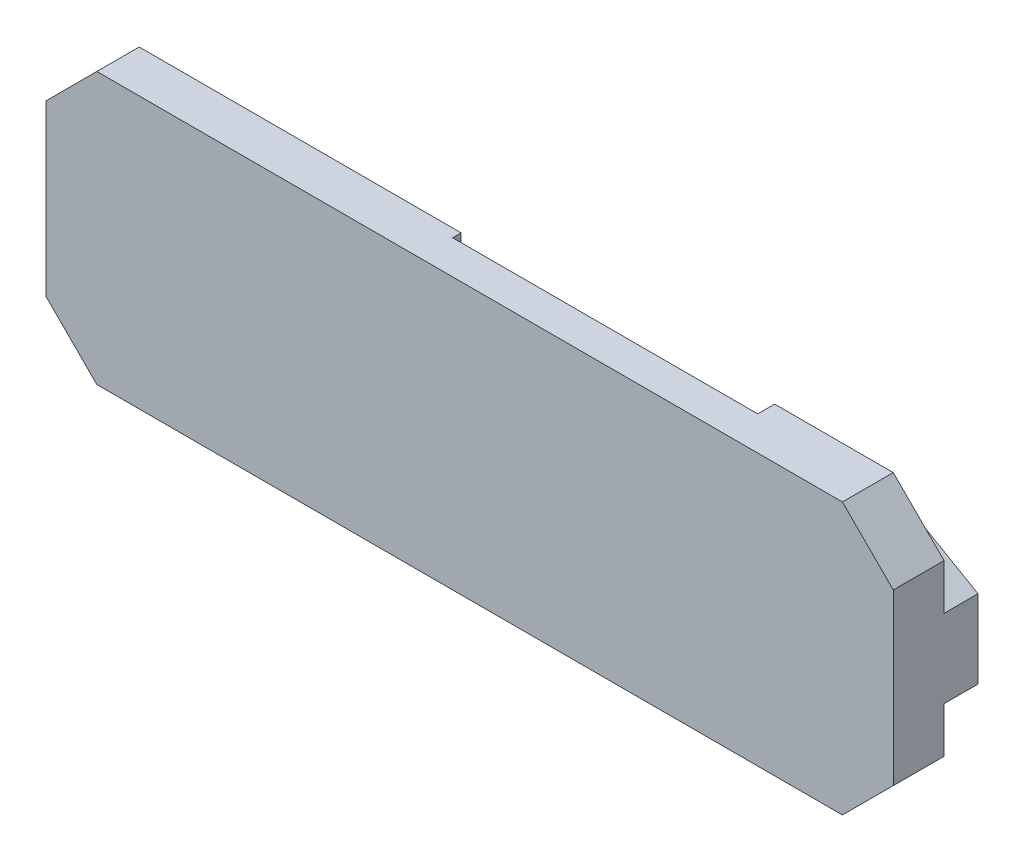
ISO-10303-21;
HEADER;
FILE_DESCRIPTION(('STEP AP214'),'2;1');
FILE_NAME('part.step','',(''),(''),'','','');
FILE_SCHEMA(('AUTOMOTIVE_DESIGN { 1 0 10303 214 1 1 1 1 }'));
ENDSEC;
DATA;
#1=APPLICATION_CONTEXT('core data for automotive mechanical design processes');
#2=APPLICATION_PROTOCOL_DEFINITION('international standard','automotive_design',2000,#1);
#3=PRODUCT_CONTEXT('',#1,'mechanical');
#4=PRODUCT('Part','Part','',(#3));
#5=PRODUCT_RELATED_PRODUCT_CATEGORY('part','',(#4));
#6=PRODUCT_DEFINITION_FORMATION('','',#4);
#7=PRODUCT_DEFINITION_CONTEXT('part definition',#1,'design');
#8=PRODUCT_DEFINITION('design','',#6,#7);
#9=PRODUCT_DEFINITION_SHAPE('','',#8);
#10=(LENGTH_UNIT() NAMED_UNIT(*) SI_UNIT(.MILLI.,.METRE.));
#11=(NAMED_UNIT(*) PLANE_ANGLE_UNIT() SI_UNIT($,.RADIAN.));
#12=(NAMED_UNIT(*) SI_UNIT($,.STERADIAN.) SOLID_ANGLE_UNIT());
#13=UNCERTAINTY_MEASURE_WITH_UNIT(LENGTH_MEASURE(1.E-05),#10,'distance_accuracy_value','');
#14=(GEOMETRIC_REPRESENTATION_CONTEXT(3) GLOBAL_UNCERTAINTY_ASSIGNED_CONTEXT((#13)) GLOBAL_UNIT_ASSIGNED_CONTEXT((#10,
#11,#12)) REPRESENTATION_CONTEXT('',''));
#15=CARTESIAN_POINT('',(0.,0.,0.));
#16=DIRECTION('',(0.,0.,1.));
#17=DIRECTION('',(1.,0.,0.));
#18=AXIS2_PLACEMENT_3D('',#15,#16,#17);
#19=CARTESIAN_POINT('',(0.,0.,0.));
#20=DIRECTION('',(0.,0.,1.));
#21=DIRECTION('',(1.,0.,0.));
#22=AXIS2_PLACEMENT_3D('',#19,#20,#21);
#23=PLANE('',#22);
#24=DIRECTION('',(0.,1.,0.));
#25=VECTOR('',#24,1.);
#26=CARTESIAN_POINT('',(40.,0.,0.));
#27=LINE('',#26,#25);
#28=CARTESIAN_POINT('',(40.,0.,0.));
#29=VERTEX_POINT('',#28);
#30=CARTESIAN_POINT('',(40.,16.,0.));
#31=VERTEX_POINT('',#30);
#32=EDGE_CURVE('E191',#29,#31,#27,.T.);
#33=ORIENTED_EDGE('',*,*,#32,.F.);
#34=DIRECTION('',(1.,0.,0.));
#35=VECTOR('',#34,1.);
#36=CARTESIAN_POINT('',(0.,0.,0.));
#37=LINE('',#36,#35);
#38=CARTESIAN_POINT('',(22.,0.,0.));
#39=VERTEX_POINT('',#38);
#40=EDGE_CURVE('E246',#39,#29,#37,.T.);
#41=ORIENTED_EDGE('',*,*,#40,.F.);
#42=DIRECTION('',(0.,-1.,0.));
#43=VECTOR('',#42,1.);
#44=CARTESIAN_POINT('',(22.,16.,0.));
#45=LINE('',#44,#43);
#46=CARTESIAN_POINT('',(22.,16.,0.));
#47=VERTEX_POINT('',#46);
#48=EDGE_CURVE('E220',#47,#39,#45,.T.);
#49=ORIENTED_EDGE('',*,*,#48,.F.);
#50=DIRECTION('',(1.,0.,0.));
#51=VECTOR('',#50,1.);
#52=CARTESIAN_POINT('',(0.,16.,0.));
#53=LINE('',#52,#51);
#54=EDGE_CURVE('E241',#47,#31,#53,.T.);
#55=ORIENTED_EDGE('',*,*,#54,.T.);
#56=EDGE_LOOP('',(#33,#41,#49,#55));
#57=FACE_BOUND('',#56,.T.);
#58=ADVANCED_FACE('F39',(#57),#23,.F.);
#59=CARTESIAN_POINT('',(50.,0.,2.));
#60=DIRECTION('',(-1.,0.,0.));
#61=DIRECTION('',(0.,0.,1.));
#62=AXIS2_PLACEMENT_3D('',#59,#60,#61);
#63=PLANE('',#62);
#64=DIRECTION('',(0.,0.,-1.));
#65=VECTOR('',#64,1.);
#66=CARTESIAN_POINT('',(50.,3.00000000000001,2.));
#67=LINE('',#66,#65);
#68=CARTESIAN_POINT('',(50.,3.00000000000001,2.));
#69=VERTEX_POINT('',#68);
#70=CARTESIAN_POINT('',(50.,3.00000000000002,-1.));
#71=VERTEX_POINT('',#70);
#72=EDGE_CURVE('E263',#69,#71,#67,.T.);
#73=ORIENTED_EDGE('',*,*,#72,.T.);
#74=DIRECTION('',(0.,-1.,0.));
#75=VECTOR('',#74,1.);
#76=CARTESIAN_POINT('',(50.,0.,-1.));
#77=LINE('',#76,#75);
#78=CARTESIAN_POINT('',(50.,5.6905989232415,-1.));
#79=VERTEX_POINT('',#78);
#80=EDGE_CURVE('E209',#79,#71,#77,.T.);
#81=ORIENTED_EDGE('',*,*,#80,.F.);
#82=DIRECTION('',(0.,0.,1.));
#83=VECTOR('',#82,1.);
#84=CARTESIAN_POINT('',(50.,5.6905989232415,-3.));
#85=LINE('',#84,#83);
#86=CARTESIAN_POINT('',(50.,5.6905989232415,-3.));
#87=VERTEX_POINT('',#86);
#88=EDGE_CURVE('E195',#87,#79,#85,.T.);
#89=ORIENTED_EDGE('',*,*,#88,.F.);
#90=DIRECTION('',(0.,-1.,0.));
#91=VECTOR('',#90,1.);
#92=CARTESIAN_POINT('',(50.,10.3094010767585,-3.));
#93=LINE('',#92,#91);
#94=CARTESIAN_POINT('',(50.,10.3094010767585,-3.));
#95=VERTEX_POINT('',#94);
#96=EDGE_CURVE('E178',#95,#87,#93,.T.);
#97=ORIENTED_EDGE('',*,*,#96,.F.);
#98=DIRECTION('',(0.,0.,1.));
#99=VECTOR('',#98,1.);
#100=CARTESIAN_POINT('',(50.,10.3094010767585,-3.));
#101=LINE('',#100,#99);
#102=CARTESIAN_POINT('',(50.,10.3094010767585,-1.));
#103=VERTEX_POINT('',#102);
#104=EDGE_CURVE('E175',#95,#103,#101,.T.);
#105=ORIENTED_EDGE('',*,*,#104,.T.);
#106=CARTESIAN_POINT('',(50.,13.,-1.));
#107=VERTEX_POINT('',#106);
#108=EDGE_CURVE('E210',#107,#103,#77,.T.);
#109=ORIENTED_EDGE('',*,*,#108,.F.);
#110=DIRECTION('',(0.,0.,-1.));
#111=VECTOR('',#110,1.);
#112=CARTESIAN_POINT('',(50.,13.,2.));
#113=LINE('',#112,#111);
#114=CARTESIAN_POINT('',(50.,13.,2.));
#115=VERTEX_POINT('',#114);
#116=EDGE_CURVE('E285',#115,#107,#113,.T.);
#117=ORIENTED_EDGE('',*,*,#116,.F.);
#118=DIRECTION('',(0.,1.,0.));
#119=VECTOR('',#118,1.);
#120=CARTESIAN_POINT('',(50.,0.,2.));
#121=LINE('',#120,#119);
#122=EDGE_CURVE('E242',#69,#115,#121,.T.);
#123=ORIENTED_EDGE('',*,*,#122,.F.);
#124=EDGE_LOOP('',(#73,#81,#89,#97,#105,#109,#117,#123));
#125=FACE_BOUND('',#124,.T.);
#126=ADVANCED_FACE('F340',(#125),#63,.F.);
#127=CARTESIAN_POINT('',(31.5,31.5,2.));
#128=DIRECTION('',(-0.707106781186547,-0.707106781186548,0.));
#129=DIRECTION('',(0.707106781186548,-0.707106781186547,0.));
#130=AXIS2_PLACEMENT_3D('',#127,#128,#129);
#131=PLANE('',#130);
#132=ORIENTED_EDGE('',*,*,#116,.T.);
#133=DIRECTION('',(0.707106781186548,-0.707106781186547,0.));
#134=VECTOR('',#133,1.);
#135=CARTESIAN_POINT('',(31.5,31.5,-1.));
#136=LINE('',#135,#134);
#137=CARTESIAN_POINT('',(47.,16.,-1.));
#138=VERTEX_POINT('',#137);
#139=EDGE_CURVE('E206',#138,#107,#136,.T.);
#140=ORIENTED_EDGE('',*,*,#139,.F.);
#141=DIRECTION('',(0.,0.,-1.));
#142=VECTOR('',#141,1.);
#143=CARTESIAN_POINT('',(47.,16.,2.));
#144=LINE('',#143,#142);
#145=CARTESIAN_POINT('',(47.,16.,2.));
#146=VERTEX_POINT('',#145);
#147=EDGE_CURVE('E283',#146,#138,#144,.T.);
#148=ORIENTED_EDGE('',*,*,#147,.F.);
#149=DIRECTION('',(-0.707106781186548,0.707106781186547,0.));
#150=VECTOR('',#149,1.);
#151=CARTESIAN_POINT('',(31.5,31.5,2.));
#152=LINE('',#151,#150);
#153=EDGE_CURVE('E245',#115,#146,#152,.T.);
#154=ORIENTED_EDGE('',*,*,#153,.F.);
#155=EDGE_LOOP('',(#132,#140,#148,#154));
#156=FACE_BOUND('',#155,.T.);
#157=ADVANCED_FACE('F336',(#156),#131,.F.);
#158=CARTESIAN_POINT('',(0.,16.,2.));
#159=DIRECTION('',(0.,1.,0.));
#160=DIRECTION('',(0.,0.,1.));
#161=AXIS2_PLACEMENT_3D('',#158,#159,#160);
#162=PLANE('',#161);
#163=ORIENTED_EDGE('',*,*,#54,.F.);
#164=DIRECTION('',(0.,0.,1.));
#165=VECTOR('',#164,1.);
#166=CARTESIAN_POINT('',(22.,16.,-0.5));
#167=LINE('',#166,#165);
#168=CARTESIAN_POINT('',(22.,16.,-0.5));
#169=VERTEX_POINT('',#168);
#170=EDGE_CURVE('E238',#169,#47,#167,.T.);
#171=ORIENTED_EDGE('',*,*,#170,.F.);
#172=DIRECTION('',(1.,0.,0.));
#173=VECTOR('',#172,1.);
#174=CARTESIAN_POINT('',(3.,16.,-0.5));
#175=LINE('',#174,#173);
#176=CARTESIAN_POINT('',(3.,16.,-0.5));
#177=VERTEX_POINT('',#176);
#178=EDGE_CURVE('E226',#177,#169,#175,.T.);
#179=ORIENTED_EDGE('',*,*,#178,.F.);
#180=DIRECTION('',(0.,0.,-1.));
#181=VECTOR('',#180,1.);
#182=CARTESIAN_POINT('',(3.,16.,2.));
#183=LINE('',#182,#181);
#184=CARTESIAN_POINT('',(3.,16.,2.));
#185=VERTEX_POINT('',#184);
#186=EDGE_CURVE('E280',#185,#177,#183,.T.);
#187=ORIENTED_EDGE('',*,*,#186,.F.);
#188=DIRECTION('',(1.,0.,0.));
#189=VECTOR('',#188,1.);
#190=CARTESIAN_POINT('',(0.,16.,2.));
#191=LINE('',#190,#189);
#192=EDGE_CURVE('E248',#185,#146,#191,.T.);
#193=ORIENTED_EDGE('',*,*,#192,.T.);
#194=ORIENTED_EDGE('',*,*,#147,.T.);
#195=DIRECTION('',(1.,0.,0.));
#196=VECTOR('',#195,1.);
#197=CARTESIAN_POINT('',(0.,16.,-1.));
#198=LINE('',#197,#196);
#199=CARTESIAN_POINT('',(40.,16.,-1.));
#200=VERTEX_POINT('',#199);
#201=EDGE_CURVE('E203',#200,#138,#198,.T.);
#202=ORIENTED_EDGE('',*,*,#201,.F.);
#203=DIRECTION('',(0.,0.,1.));
#204=VECTOR('',#203,1.);
#205=CARTESIAN_POINT('',(40.,16.,-1.));
#206=LINE('',#205,#204);
#207=EDGE_CURVE('E214',#200,#31,#206,.T.);
#208=ORIENTED_EDGE('',*,*,#207,.T.);
#209=EDGE_LOOP('',(#163,#171,#179,#187,#193,#194,#202,#208));
#210=FACE_BOUND('',#209,.T.);
#211=ADVANCED_FACE('F314',(#210),#162,.T.);
#212=CARTESIAN_POINT('',(-6.5,6.5,2.));
#213=DIRECTION('',(-0.707106781186547,0.707106781186548,0.));
#214=DIRECTION('',(-0.707106781186548,-0.707106781186547,0.));
#215=AXIS2_PLACEMENT_3D('',#212,#213,#214);
#216=PLANE('',#215);
#217=DIRECTION('',(0.707106781186548,0.707106781186547,0.));
#218=VECTOR('',#217,1.);
#219=CARTESIAN_POINT('',(0.,13.,-0.5));
#220=LINE('',#219,#218);
#221=CARTESIAN_POINT('',(1.,14.,-0.5));
#222=VERTEX_POINT('',#221);
#223=EDGE_CURVE('E224',#222,#177,#220,.T.);
#224=ORIENTED_EDGE('',*,*,#223,.F.);
#225=CARTESIAN_POINT('',(1.,14.,0.5));
#226=DIRECTION('',(-0.707106781186547,0.707106781186548,0.));
#227=DIRECTION('',(0.707106781186548,0.707106781186547,0.));
#228=AXIS2_PLACEMENT_3D('',#225,#226,#227);
#229=ELLIPSE('',#228,1.41421356237309,1.);
#230=CARTESIAN_POINT('',(0.,13.,0.5));
#231=VERTEX_POINT('',#230);
#232=EDGE_CURVE('E290',#222,#231,#229,.T.);
#233=ORIENTED_EDGE('',*,*,#232,.T.);
#234=DIRECTION('',(0.,0.,-1.));
#235=VECTOR('',#234,1.);
#236=CARTESIAN_POINT('',(0.,13.,2.));
#237=LINE('',#236,#235);
#238=CARTESIAN_POINT('',(0.,13.,2.));
#239=VERTEX_POINT('',#238);
#240=EDGE_CURVE('E277',#239,#231,#237,.T.);
#241=ORIENTED_EDGE('',*,*,#240,.F.);
#242=DIRECTION('',(0.707106781186548,0.707106781186547,0.));
#243=VECTOR('',#242,1.);
#244=CARTESIAN_POINT('',(-6.5,6.5,2.));
#245=LINE('',#244,#243);
#246=EDGE_CURVE('E251',#239,#185,#245,.T.);
#247=ORIENTED_EDGE('',*,*,#246,.T.);
#248=ORIENTED_EDGE('',*,*,#186,.T.);
#249=EDGE_LOOP('',(#224,#233,#241,#247,#248));
#250=FACE_BOUND('',#249,.T.);
#251=ADVANCED_FACE('F307',(#250),#216,.T.);
#252=CARTESIAN_POINT('',(0.,0.,2.));
#253=DIRECTION('',(-1.,0.,0.));
#254=DIRECTION('',(0.,0.,1.));
#255=AXIS2_PLACEMENT_3D('',#252,#253,#254);
#256=PLANE('',#255);
#257=ORIENTED_EDGE('',*,*,#240,.T.);
#258=DIRECTION('',(0.,1.,0.));
#259=VECTOR('',#258,1.);
#260=CARTESIAN_POINT('',(0.,0.,0.5));
#261=LINE('',#260,#259);
#262=CARTESIAN_POINT('',(0.,3.,0.5));
#263=VERTEX_POINT('',#262);
#264=EDGE_CURVE('E47',#231,#263,#261,.F.);
#265=ORIENTED_EDGE('',*,*,#264,.T.);
#266=DIRECTION('',(0.,0.,-1.));
#267=VECTOR('',#266,1.);
#268=CARTESIAN_POINT('',(0.,3.,2.));
#269=LINE('',#268,#267);
#270=CARTESIAN_POINT('',(0.,3.,2.));
#271=VERTEX_POINT('',#270);
#272=EDGE_CURVE('E274',#271,#263,#269,.T.);
#273=ORIENTED_EDGE('',*,*,#272,.F.);
#274=DIRECTION('',(0.,1.,0.));
#275=VECTOR('',#274,1.);
#276=CARTESIAN_POINT('',(0.,0.,2.));
#277=LINE('',#276,#275);
#278=EDGE_CURVE('E254',#271,#239,#277,.T.);
#279=ORIENTED_EDGE('',*,*,#278,.T.);
#280=EDGE_LOOP('',(#257,#265,#273,#279));
#281=FACE_BOUND('',#280,.T.);
#282=ADVANCED_FACE('F293',(#281),#256,.T.);
#283=CARTESIAN_POINT('',(1.5,1.5,2.));
#284=DIRECTION('',(0.707106781186548,0.707106781186547,0.));
#285=DIRECTION('',(-0.707106781186547,0.707106781186548,0.));
#286=AXIS2_PLACEMENT_3D('',#283,#284,#285);
#287=PLANE('',#286);
#288=ORIENTED_EDGE('',*,*,#272,.T.);
#289=CARTESIAN_POINT('',(1.,2.,0.5));
#290=DIRECTION('',(0.707106781186548,0.707106781186547,0.));
#291=DIRECTION('',(-0.707106781186547,0.707106781186548,0.));
#292=AXIS2_PLACEMENT_3D('',#289,#290,#291);
#293=ELLIPSE('',#292,1.4142135623731,1.);
#294=CARTESIAN_POINT('',(1.,2.,-0.5));
#295=VERTEX_POINT('',#294);
#296=EDGE_CURVE('E11',#263,#295,#293,.F.);
#297=ORIENTED_EDGE('',*,*,#296,.T.);
#298=DIRECTION('',(-0.707106781186547,0.707106781186548,0.));
#299=VECTOR('',#298,1.);
#300=CARTESIAN_POINT('',(3.,0.,-0.5));
#301=LINE('',#300,#299);
#302=CARTESIAN_POINT('',(3.,0.,-0.5));
#303=VERTEX_POINT('',#302);
#304=EDGE_CURVE('E221',#303,#295,#301,.T.);
#305=ORIENTED_EDGE('',*,*,#304,.F.);
#306=DIRECTION('',(0.,0.,-1.));
#307=VECTOR('',#306,1.);
#308=CARTESIAN_POINT('',(3.,0.,2.));
#309=LINE('',#308,#307);
#310=CARTESIAN_POINT('',(3.,0.,2.));
#311=VERTEX_POINT('',#310);
#312=EDGE_CURVE('E272',#311,#303,#309,.T.);
#313=ORIENTED_EDGE('',*,*,#312,.F.);
#314=DIRECTION('',(0.707106781186547,-0.707106781186548,0.));
#315=VECTOR('',#314,1.);
#316=CARTESIAN_POINT('',(1.5,1.5,2.));
#317=LINE('',#316,#315);
#318=EDGE_CURVE('E257',#271,#311,#317,.T.);
#319=ORIENTED_EDGE('',*,*,#318,.F.);
#320=EDGE_LOOP('',(#288,#297,#305,#313,#319));
#321=FACE_BOUND('',#320,.T.);
#322=ADVANCED_FACE('F298',(#321),#287,.F.);
#323=CARTESIAN_POINT('',(0.,0.,2.));
#324=DIRECTION('',(0.,1.,0.));
#325=DIRECTION('',(0.,0.,1.));
#326=AXIS2_PLACEMENT_3D('',#323,#324,#325);
#327=PLANE('',#326);
#328=ORIENTED_EDGE('',*,*,#312,.T.);
#329=DIRECTION('',(-1.,0.,0.));
#330=VECTOR('',#329,1.);
#331=CARTESIAN_POINT('',(22.,0.,-0.5));
#332=LINE('',#331,#330);
#333=CARTESIAN_POINT('',(22.,0.,-0.5));
#334=VERTEX_POINT('',#333);
#335=EDGE_CURVE('E230',#334,#303,#332,.T.);
#336=ORIENTED_EDGE('',*,*,#335,.F.);
#337=DIRECTION('',(0.,0.,1.));
#338=VECTOR('',#337,1.);
#339=CARTESIAN_POINT('',(22.,0.,-0.5));
#340=LINE('',#339,#338);
#341=EDGE_CURVE('E233',#334,#39,#340,.T.);
#342=ORIENTED_EDGE('',*,*,#341,.T.);
#343=ORIENTED_EDGE('',*,*,#40,.T.);
#344=DIRECTION('',(0.,0.,1.));
#345=VECTOR('',#344,1.);
#346=CARTESIAN_POINT('',(40.,0.,-1.));
#347=LINE('',#346,#345);
#348=CARTESIAN_POINT('',(40.,0.,-1.));
#349=VERTEX_POINT('',#348);
#350=EDGE_CURVE('E218',#349,#29,#347,.T.);
#351=ORIENTED_EDGE('',*,*,#350,.F.);
#352=DIRECTION('',(-1.,0.,0.));
#353=VECTOR('',#352,1.);
#354=CARTESIAN_POINT('',(0.,0.,-1.));
#355=LINE('',#354,#353);
#356=CARTESIAN_POINT('',(47.,0.,-1.));
#357=VERTEX_POINT('',#356);
#358=EDGE_CURVE('E193',#357,#349,#355,.T.);
#359=ORIENTED_EDGE('',*,*,#358,.F.);
#360=DIRECTION('',(0.,0.,-1.));
#361=VECTOR('',#360,1.);
#362=CARTESIAN_POINT('',(47.,0.,2.));
#363=LINE('',#362,#361);
#364=CARTESIAN_POINT('',(47.,0.,2.));
#365=VERTEX_POINT('',#364);
#366=EDGE_CURVE('E270',#365,#357,#363,.T.);
#367=ORIENTED_EDGE('',*,*,#366,.F.);
#368=DIRECTION('',(1.,0.,0.));
#369=VECTOR('',#368,1.);
#370=CARTESIAN_POINT('',(0.,0.,2.));
#371=LINE('',#370,#369);
#372=EDGE_CURVE('E259',#311,#365,#371,.T.);
#373=ORIENTED_EDGE('',*,*,#372,.F.);
#374=EDGE_LOOP('',(#328,#336,#342,#343,#351,#359,#367,#373));
#375=FACE_BOUND('',#374,.T.);
#376=ADVANCED_FACE('F321',(#375),#327,.F.);
#377=CARTESIAN_POINT('',(23.5,-23.5,2.));
#378=DIRECTION('',(-0.707106781186547,0.707106781186548,0.));
#379=DIRECTION('',(-0.707106781186548,-0.707106781186547,0.));
#380=AXIS2_PLACEMENT_3D('',#377,#378,#379);
#381=PLANE('',#380);
#382=ORIENTED_EDGE('',*,*,#366,.T.);
#383=DIRECTION('',(-0.707106781186548,-0.707106781186547,0.));
#384=VECTOR('',#383,1.);
#385=CARTESIAN_POINT('',(23.5,-23.5,-1.));
#386=LINE('',#385,#384);
#387=EDGE_CURVE('E212',#71,#357,#386,.T.);
#388=ORIENTED_EDGE('',*,*,#387,.F.);
#389=ORIENTED_EDGE('',*,*,#72,.F.);
#390=DIRECTION('',(0.707106781186548,0.707106781186547,0.));
#391=VECTOR('',#390,1.);
#392=CARTESIAN_POINT('',(23.5,-23.5,2.));
#393=LINE('',#392,#391);
#394=EDGE_CURVE('E261',#365,#69,#393,.T.);
#395=ORIENTED_EDGE('',*,*,#394,.F.);
#396=EDGE_LOOP('',(#382,#388,#389,#395));
#397=FACE_BOUND('',#396,.T.);
#398=ADVANCED_FACE('F380',(#397),#381,.F.);
#399=CARTESIAN_POINT('',(0.,0.,2.));
#400=DIRECTION('',(0.,0.,1.));
#401=DIRECTION('',(1.,0.,0.));
#402=AXIS2_PLACEMENT_3D('',#399,#400,#401);
#403=PLANE('',#402);
#404=ORIENTED_EDGE('',*,*,#122,.T.);
#405=ORIENTED_EDGE('',*,*,#153,.T.);
#406=ORIENTED_EDGE('',*,*,#192,.F.);
#407=ORIENTED_EDGE('',*,*,#246,.F.);
#408=ORIENTED_EDGE('',*,*,#278,.F.);
#409=ORIENTED_EDGE('',*,*,#318,.T.);
#410=ORIENTED_EDGE('',*,*,#372,.T.);
#411=ORIENTED_EDGE('',*,*,#394,.T.);
#412=EDGE_LOOP('',(#404,#405,#406,#407,#408,#409,#410,#411));
#413=FACE_BOUND('',#412,.T.);
#414=ADVANCED_FACE('F327',(#413),#403,.T.);
#415=CARTESIAN_POINT('',(22.,16.,-0.5));
#416=DIRECTION('',(-1.,0.,0.));
#417=DIRECTION('',(0.,-1.,0.));
#418=AXIS2_PLACEMENT_3D('',#415,#416,#417);
#419=PLANE('',#418);
#420=ORIENTED_EDGE('',*,*,#48,.T.);
#421=ORIENTED_EDGE('',*,*,#341,.F.);
#422=DIRECTION('',(0.,-1.,0.));
#423=VECTOR('',#422,1.);
#424=CARTESIAN_POINT('',(22.,16.,-0.5));
#425=LINE('',#424,#423);
#426=EDGE_CURVE('E228',#169,#334,#425,.T.);
#427=ORIENTED_EDGE('',*,*,#426,.F.);
#428=ORIENTED_EDGE('',*,*,#170,.T.);
#429=EDGE_LOOP('',(#420,#421,#427,#428));
#430=FACE_BOUND('',#429,.T.);
#431=ADVANCED_FACE('F319',(#430),#419,.F.);
#432=CARTESIAN_POINT('',(0.,0.,-0.5));
#433=DIRECTION('',(0.,0.,-1.));
#434=DIRECTION('',(-1.,0.,0.));
#435=AXIS2_PLACEMENT_3D('',#432,#433,#434);
#436=PLANE('',#435);
#437=ORIENTED_EDGE('',*,*,#304,.T.);
#438=DIRECTION('',(0.,1.,0.));
#439=VECTOR('',#438,1.);
#440=CARTESIAN_POINT('',(1.,0.,-0.5));
#441=LINE('',#440,#439);
#442=EDGE_CURVE('E287',#295,#222,#441,.T.);
#443=ORIENTED_EDGE('',*,*,#442,.T.);
#444=ORIENTED_EDGE('',*,*,#223,.T.);
#445=ORIENTED_EDGE('',*,*,#178,.T.);
#446=ORIENTED_EDGE('',*,*,#426,.T.);
#447=ORIENTED_EDGE('',*,*,#335,.T.);
#448=EDGE_LOOP('',(#437,#443,#444,#445,#446,#447));
#449=FACE_BOUND('',#448,.T.);
#450=ADVANCED_FACE('F305',(#449),#436,.T.);
#451=CARTESIAN_POINT('',(1.,0.,0.5));
#452=DIRECTION('',(0.,1.,0.));
#453=DIRECTION('',(0.,0.,1.));
#454=AXIS2_PLACEMENT_3D('',#451,#452,#453);
#455=CYLINDRICAL_SURFACE('',#454,1.);
#456=ORIENTED_EDGE('',*,*,#296,.F.);
#457=ORIENTED_EDGE('',*,*,#264,.F.);
#458=ORIENTED_EDGE('',*,*,#232,.F.);
#459=ORIENTED_EDGE('',*,*,#442,.F.);
#460=EDGE_LOOP('',(#456,#457,#458,#459));
#461=FACE_BOUND('',#460,.T.);
#462=ADVANCED_FACE('F41',(#461),#455,.T.);
#463=CARTESIAN_POINT('',(40.,0.,-1.));
#464=DIRECTION('',(1.,0.,0.));
#465=DIRECTION('',(0.,1.,0.));
#466=AXIS2_PLACEMENT_3D('',#463,#464,#465);
#467=PLANE('',#466);
#468=ORIENTED_EDGE('',*,*,#32,.T.);
#469=ORIENTED_EDGE('',*,*,#207,.F.);
#470=DIRECTION('',(0.,1.,0.));
#471=VECTOR('',#470,1.);
#472=CARTESIAN_POINT('',(40.,0.,-1.));
#473=LINE('',#472,#471);
#474=EDGE_CURVE('E201',#349,#200,#473,.T.);
#475=ORIENTED_EDGE('',*,*,#474,.F.);
#476=ORIENTED_EDGE('',*,*,#350,.T.);
#477=EDGE_LOOP('',(#468,#469,#475,#476));
#478=FACE_BOUND('',#477,.T.);
#479=ADVANCED_FACE('F370',(#478),#467,.F.);
#480=CARTESIAN_POINT('',(0.,0.,-1.));
#481=DIRECTION('',(0.,0.,-1.));
#482=DIRECTION('',(-1.,0.,0.));
#483=AXIS2_PLACEMENT_3D('',#480,#481,#482);
#484=PLANE('',#483);
#485=DIRECTION('',(-0.866025403784439,-0.5,0.));
#486=VECTOR('',#485,1.);
#487=CARTESIAN_POINT('',(50.,5.6905989232415,-1.));
#488=LINE('',#487,#486);
#489=CARTESIAN_POINT('',(46.,3.381197846483,-1.));
#490=VERTEX_POINT('',#489);
#491=EDGE_CURVE('E342',#79,#490,#488,.T.);
#492=ORIENTED_EDGE('',*,*,#491,.F.);
#493=ORIENTED_EDGE('',*,*,#80,.T.);
#494=ORIENTED_EDGE('',*,*,#387,.T.);
#495=ORIENTED_EDGE('',*,*,#358,.T.);
#496=ORIENTED_EDGE('',*,*,#474,.T.);
#497=ORIENTED_EDGE('',*,*,#201,.T.);
#498=ORIENTED_EDGE('',*,*,#139,.T.);
#499=ORIENTED_EDGE('',*,*,#108,.T.);
#500=DIRECTION('',(0.866025403784438,-0.500000000000001,0.));
#501=VECTOR('',#500,1.);
#502=CARTESIAN_POINT('',(46.,12.618802153517,-1.));
#503=LINE('',#502,#501);
#504=CARTESIAN_POINT('',(46.,12.618802153517,-1.));
#505=VERTEX_POINT('',#504);
#506=EDGE_CURVE('E341',#505,#103,#503,.T.);
#507=ORIENTED_EDGE('',*,*,#506,.F.);
#508=DIRECTION('',(0.866025403784439,0.499999999999999,0.));
#509=VECTOR('',#508,1.);
#510=CARTESIAN_POINT('',(42.,10.3094010767585,-1.));
#511=LINE('',#510,#509);
#512=CARTESIAN_POINT('',(42.,10.3094010767585,-1.));
#513=VERTEX_POINT('',#512);
#514=EDGE_CURVE('E190',#513,#505,#511,.T.);
#515=ORIENTED_EDGE('',*,*,#514,.F.);
#516=DIRECTION('',(0.,1.,0.));
#517=VECTOR('',#516,1.);
#518=CARTESIAN_POINT('',(42.,5.69059892324151,-1.));
#519=LINE('',#518,#517);
#520=CARTESIAN_POINT('',(42.,5.69059892324151,-1.));
#521=VERTEX_POINT('',#520);
#522=EDGE_CURVE('E59',#521,#513,#519,.T.);
#523=ORIENTED_EDGE('',*,*,#522,.F.);
#524=DIRECTION('',(-0.866025403784439,0.5,0.));
#525=VECTOR('',#524,1.);
#526=CARTESIAN_POINT('',(46.,3.381197846483,-1.));
#527=LINE('',#526,#525);
#528=EDGE_CURVE('E54',#490,#521,#527,.T.);
#529=ORIENTED_EDGE('',*,*,#528,.F.);
#530=EDGE_LOOP('',(#492,#493,#494,#495,#496,#497,#498,#499,#507,#515,#523,#529));
#531=FACE_BOUND('',#530,.T.);
#532=ADVANCED_FACE('F333',(#531),#484,.T.);
#533=CARTESIAN_POINT('',(42.,10.3094010767585,-3.));
#534=DIRECTION('',(0.499999999999999,-0.866025403784439,0.));
#535=DIRECTION('',(0.866025403784439,0.499999999999999,0.));
#536=AXIS2_PLACEMENT_3D('',#533,#534,#535);
#537=PLANE('',#536);
#538=ORIENTED_EDGE('',*,*,#514,.T.);
#539=DIRECTION('',(0.,0.,1.));
#540=VECTOR('',#539,1.);
#541=CARTESIAN_POINT('',(46.,12.618802153517,-3.));
#542=LINE('',#541,#540);
#543=CARTESIAN_POINT('',(46.,12.618802153517,-3.));
#544=VERTEX_POINT('',#543);
#545=EDGE_CURVE('E172',#544,#505,#542,.T.);
#546=ORIENTED_EDGE('',*,*,#545,.F.);
#547=DIRECTION('',(0.866025403784439,0.499999999999999,0.));
#548=VECTOR('',#547,1.);
#549=CARTESIAN_POINT('',(42.,10.3094010767585,-3.));
#550=LINE('',#549,#548);
#551=CARTESIAN_POINT('',(42.,10.3094010767585,-3.));
#552=VERTEX_POINT('',#551);
#553=EDGE_CURVE('E179',#552,#544,#550,.T.);
#554=ORIENTED_EDGE('',*,*,#553,.F.);
#555=DIRECTION('',(0.,0.,1.));
#556=VECTOR('',#555,1.);
#557=CARTESIAN_POINT('',(42.,10.3094010767585,-3.));
#558=LINE('',#557,#556);
#559=EDGE_CURVE('E350',#552,#513,#558,.T.);
#560=ORIENTED_EDGE('',*,*,#559,.T.);
#561=EDGE_LOOP('',(#538,#546,#554,#560));
#562=FACE_BOUND('',#561,.T.);
#563=ADVANCED_FACE('F189',(#562),#537,.F.);
#564=CARTESIAN_POINT('',(46.,12.618802153517,-3.));
#565=DIRECTION('',(-0.500000000000001,-0.866025403784438,0.));
#566=DIRECTION('',(0.866025403784438,-0.500000000000001,0.));
#567=AXIS2_PLACEMENT_3D('',#564,#565,#566);
#568=PLANE('',#567);
#569=ORIENTED_EDGE('',*,*,#506,.T.);
#570=ORIENTED_EDGE('',*,*,#104,.F.);
#571=DIRECTION('',(0.866025403784438,-0.500000000000001,0.));
#572=VECTOR('',#571,1.);
#573=CARTESIAN_POINT('',(46.,12.618802153517,-3.));
#574=LINE('',#573,#572);
#575=EDGE_CURVE('E167',#544,#95,#574,.T.);
#576=ORIENTED_EDGE('',*,*,#575,.F.);
#577=ORIENTED_EDGE('',*,*,#545,.T.);
#578=EDGE_LOOP('',(#569,#570,#576,#577));
#579=FACE_BOUND('',#578,.T.);
#580=ADVANCED_FACE('F170',(#579),#568,.F.);
#581=CARTESIAN_POINT('',(50.,5.6905989232415,-3.));
#582=DIRECTION('',(-0.5,0.866025403784439,0.));
#583=DIRECTION('',(-0.866025403784439,-0.5,0.));
#584=AXIS2_PLACEMENT_3D('',#581,#582,#583);
#585=PLANE('',#584);
#586=ORIENTED_EDGE('',*,*,#491,.T.);
#587=DIRECTION('',(0.,0.,1.));
#588=VECTOR('',#587,1.);
#589=CARTESIAN_POINT('',(46.,3.381197846483,-3.));
#590=LINE('',#589,#588);
#591=CARTESIAN_POINT('',(46.,3.381197846483,-3.));
#592=VERTEX_POINT('',#591);
#593=EDGE_CURVE('E355',#592,#490,#590,.T.);
#594=ORIENTED_EDGE('',*,*,#593,.F.);
#595=DIRECTION('',(-0.866025403784439,-0.5,0.));
#596=VECTOR('',#595,1.);
#597=CARTESIAN_POINT('',(50.,5.6905989232415,-3.));
#598=LINE('',#597,#596);
#599=EDGE_CURVE('E363',#87,#592,#598,.T.);
#600=ORIENTED_EDGE('',*,*,#599,.F.);
#601=ORIENTED_EDGE('',*,*,#88,.T.);
#602=EDGE_LOOP('',(#586,#594,#600,#601));
#603=FACE_BOUND('',#602,.T.);
#604=ADVANCED_FACE('F361',(#603),#585,.F.);
#605=CARTESIAN_POINT('',(46.,3.381197846483,-3.));
#606=DIRECTION('',(0.5,0.866025403784439,0.));
#607=DIRECTION('',(-0.866025403784439,0.5,0.));
#608=AXIS2_PLACEMENT_3D('',#605,#606,#607);
#609=PLANE('',#608);
#610=ORIENTED_EDGE('',*,*,#528,.T.);
#611=DIRECTION('',(0.,0.,1.));
#612=VECTOR('',#611,1.);
#613=CARTESIAN_POINT('',(42.,5.69059892324151,-3.));
#614=LINE('',#613,#612);
#615=CARTESIAN_POINT('',(42.,5.69059892324151,-3.));
#616=VERTEX_POINT('',#615);
#617=EDGE_CURVE('E352',#616,#521,#614,.T.);
#618=ORIENTED_EDGE('',*,*,#617,.F.);
#619=DIRECTION('',(-0.866025403784439,0.5,0.));
#620=VECTOR('',#619,1.);
#621=CARTESIAN_POINT('',(46.,3.381197846483,-3.));
#622=LINE('',#621,#620);
#623=EDGE_CURVE('E608',#592,#616,#622,.T.);
#624=ORIENTED_EDGE('',*,*,#623,.F.);
#625=ORIENTED_EDGE('',*,*,#593,.T.);
#626=EDGE_LOOP('',(#610,#618,#624,#625));
#627=FACE_BOUND('',#626,.T.);
#628=ADVANCED_FACE('F473',(#627),#609,.F.);
#629=CARTESIAN_POINT('',(42.,5.69059892324151,-3.));
#630=DIRECTION('',(1.,0.,0.));
#631=DIRECTION('',(0.,0.,-1.));
#632=AXIS2_PLACEMENT_3D('',#629,#630,#631);
#633=PLANE('',#632);
#634=ORIENTED_EDGE('',*,*,#522,.T.);
#635=ORIENTED_EDGE('',*,*,#559,.F.);
#636=DIRECTION('',(0.,1.,0.));
#637=VECTOR('',#636,1.);
#638=CARTESIAN_POINT('',(42.,5.69059892324151,-3.));
#639=LINE('',#638,#637);
#640=EDGE_CURVE('E184',#616,#552,#639,.T.);
#641=ORIENTED_EDGE('',*,*,#640,.F.);
#642=ORIENTED_EDGE('',*,*,#617,.T.);
#643=EDGE_LOOP('',(#634,#635,#641,#642));
#644=FACE_BOUND('',#643,.T.);
#645=ADVANCED_FACE('F480',(#644),#633,.F.);
#646=CARTESIAN_POINT('',(0.,0.,-3.));
#647=DIRECTION('',(0.,0.,-1.));
#648=DIRECTION('',(-1.,0.,0.));
#649=AXIS2_PLACEMENT_3D('',#646,#647,#648);
#650=PLANE('',#649);
#651=ORIENTED_EDGE('',*,*,#553,.T.);
#652=ORIENTED_EDGE('',*,*,#575,.T.);
#653=ORIENTED_EDGE('',*,*,#96,.T.);
#654=ORIENTED_EDGE('',*,*,#599,.T.);
#655=ORIENTED_EDGE('',*,*,#623,.T.);
#656=ORIENTED_EDGE('',*,*,#640,.T.);
#657=EDGE_LOOP('',(#651,#652,#653,#654,#655,#656));
#658=FACE_BOUND('',#657,.T.);
#659=ADVANCED_FACE('F182',(#658),#650,.T.);
#660=CLOSED_SHELL('',(#58,#126,#157,#211,#251,#282,#322,#376,#398,#414,#431,#450,#462,#479,#532,
#563,#580,#604,#628,#645,#659));
#661=MANIFOLD_SOLID_BREP('B2',#660);
#662=ADVANCED_BREP_SHAPE_REPRESENTATION('',(#18,#661),#14);
#663=SHAPE_DEFINITION_REPRESENTATION(#9,#662);
ENDSEC;
END-ISO-10303-21;
